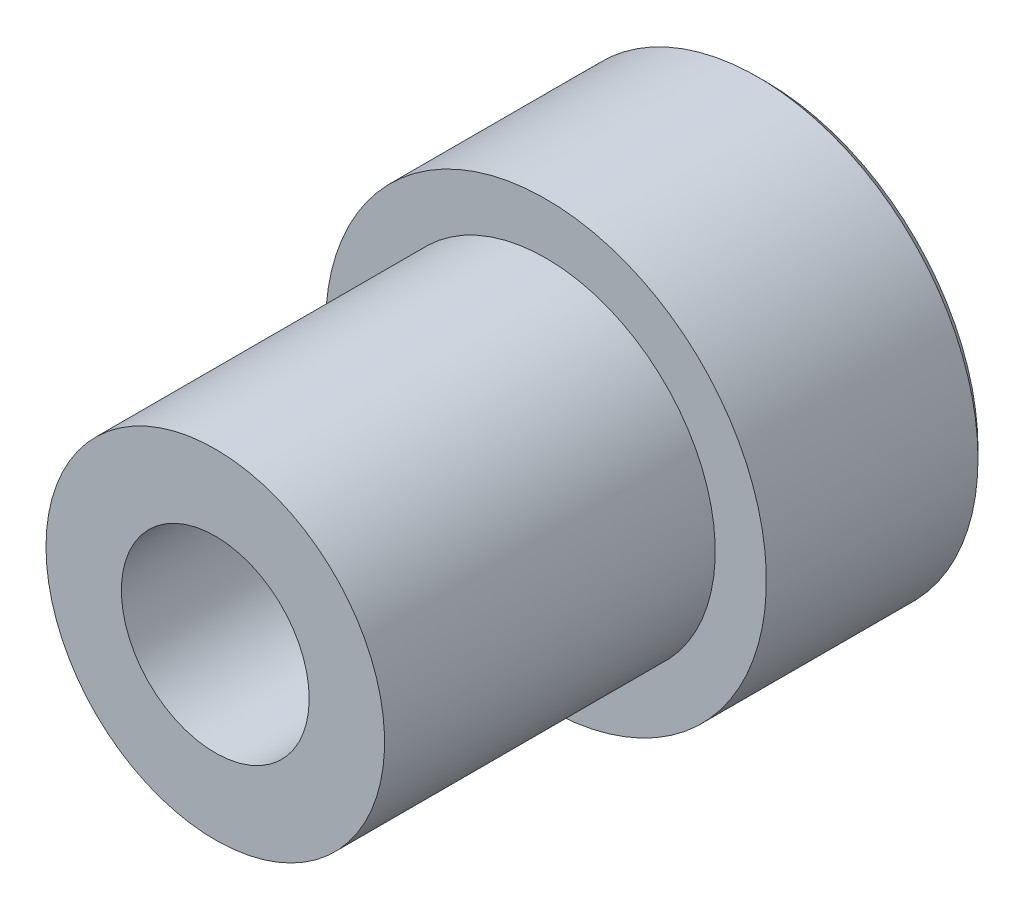
ISO-10303-21;
HEADER;
FILE_DESCRIPTION(('STEP AP214'),'2;1');
FILE_NAME('part.step','',(''),(''),'','','');
FILE_SCHEMA(('AUTOMOTIVE_DESIGN { 1 0 10303 214 1 1 1 1 }'));
ENDSEC;
DATA;
#1=APPLICATION_CONTEXT('core data for automotive mechanical design processes');
#2=APPLICATION_PROTOCOL_DEFINITION('international standard','automotive_design',2000,#1);
#3=PRODUCT_CONTEXT('',#1,'mechanical');
#4=PRODUCT('Part','Part','',(#3));
#5=PRODUCT_RELATED_PRODUCT_CATEGORY('part','',(#4));
#6=PRODUCT_DEFINITION_FORMATION('','',#4);
#7=PRODUCT_DEFINITION_CONTEXT('part definition',#1,'design');
#8=PRODUCT_DEFINITION('design','',#6,#7);
#9=PRODUCT_DEFINITION_SHAPE('','',#8);
#10=(LENGTH_UNIT() NAMED_UNIT(*) SI_UNIT(.MILLI.,.METRE.));
#11=(NAMED_UNIT(*) PLANE_ANGLE_UNIT() SI_UNIT($,.RADIAN.));
#12=(NAMED_UNIT(*) SI_UNIT($,.STERADIAN.) SOLID_ANGLE_UNIT());
#13=UNCERTAINTY_MEASURE_WITH_UNIT(LENGTH_MEASURE(1.E-05),#10,'distance_accuracy_value','');
#14=(GEOMETRIC_REPRESENTATION_CONTEXT(3) GLOBAL_UNCERTAINTY_ASSIGNED_CONTEXT((#13)) GLOBAL_UNIT_ASSIGNED_CONTEXT((#10,
#11,#12)) REPRESENTATION_CONTEXT('',''));
#15=CARTESIAN_POINT('',(0.,0.,0.));
#16=DIRECTION('',(0.,0.,1.));
#17=DIRECTION('',(1.,0.,0.));
#18=AXIS2_PLACEMENT_3D('',#15,#16,#17);
#19=CARTESIAN_POINT('',(0.,0.,-15.875));
#20=DIRECTION('',(0.,0.,1.));
#21=DIRECTION('',(-1.,0.,0.));
#22=AXIS2_PLACEMENT_3D('',#19,#20,#21);
#23=CYLINDRICAL_SURFACE('',#22,6.35);
#24=CARTESIAN_POINT('',(0.,0.,-15.621));
#25=DIRECTION('',(0.,0.,1.));
#26=DIRECTION('',(1.,0.,0.));
#27=AXIS2_PLACEMENT_3D('',#24,#25,#26);
#28=CIRCLE('',#27,6.35);
#29=CARTESIAN_POINT('',(6.35,0.,-15.621));
#30=VERTEX_POINT('',#29);
#31=EDGE_CURVE('E10',#30,#30,#28,.F.);
#32=ORIENTED_EDGE('',*,*,#31,.F.);
#33=EDGE_LOOP('',(#32));
#34=FACE_BOUND('',#33,.T.);
#35=CARTESIAN_POINT('',(0.,0.,-9.525));
#36=DIRECTION('',(0.,0.,-1.));
#37=DIRECTION('',(-1.,0.,0.));
#38=AXIS2_PLACEMENT_3D('',#35,#36,#37);
#39=CIRCLE('',#38,6.35);
#40=CARTESIAN_POINT('',(-6.35,0.,-9.525));
#41=VERTEX_POINT('',#40);
#42=EDGE_CURVE('E49',#41,#41,#39,.T.);
#43=ORIENTED_EDGE('',*,*,#42,.T.);
#44=EDGE_LOOP('',(#43));
#45=FACE_BOUND('',#44,.T.);
#46=ADVANCED_FACE('F45',(#34,#45),#23,.T.);
#47=CARTESIAN_POINT('',(0.,0.,-15.875));
#48=DIRECTION('',(0.,0.,-1.));
#49=DIRECTION('',(1.,0.,0.));
#50=AXIS2_PLACEMENT_3D('',#47,#48,#49);
#51=PLANE('',#50);
#52=CARTESIAN_POINT('',(0.,0.,-15.875));
#53=DIRECTION('',(0.,0.,1.));
#54=DIRECTION('',(1.,0.,0.));
#55=AXIS2_PLACEMENT_3D('',#52,#53,#54);
#56=CIRCLE('',#55,2.7051);
#57=CARTESIAN_POINT('',(2.7051,0.,-15.875));
#58=VERTEX_POINT('',#57);
#59=EDGE_CURVE('E74',#58,#58,#56,.T.);
#60=ORIENTED_EDGE('',*,*,#59,.T.);
#61=EDGE_LOOP('',(#60));
#62=FACE_BOUND('',#61,.T.);
#63=CARTESIAN_POINT('',(0.,0.,-15.875));
#64=DIRECTION('',(0.,0.,1.));
#65=DIRECTION('',(1.,0.,0.));
#66=AXIS2_PLACEMENT_3D('',#63,#64,#65);
#67=CIRCLE('',#66,6.096);
#68=CARTESIAN_POINT('',(6.096,0.,-15.875));
#69=VERTEX_POINT('',#68);
#70=EDGE_CURVE('E54',#69,#69,#67,.T.);
#71=ORIENTED_EDGE('',*,*,#70,.F.);
#72=EDGE_LOOP('',(#71));
#73=FACE_BOUND('',#72,.T.);
#74=ADVANCED_FACE('F81',(#62,#73),#51,.T.);
#75=CARTESIAN_POINT('',(0.,0.,-15.875));
#76=DIRECTION('',(0.,0.,1.));
#77=DIRECTION('',(-1.,0.,0.));
#78=AXIS2_PLACEMENT_3D('',#75,#76,#77);
#79=CONICAL_SURFACE('',#78,6.096,0.785398163397445);
#80=ORIENTED_EDGE('',*,*,#31,.T.);
#81=EDGE_LOOP('',(#80));
#82=FACE_BOUND('',#81,.T.);
#83=ORIENTED_EDGE('',*,*,#70,.T.);
#84=EDGE_LOOP('',(#83));
#85=FACE_BOUND('',#84,.T.);
#86=ADVANCED_FACE('F47',(#82,#85),#79,.T.);
#87=CARTESIAN_POINT('',(0.,0.,-9.525));
#88=DIRECTION('',(0.,0.,1.));
#89=DIRECTION('',(-1.,0.,0.));
#90=AXIS2_PLACEMENT_3D('',#87,#88,#89);
#91=PLANE('',#90);
#92=CARTESIAN_POINT('',(0.,0.,-9.525));
#93=DIRECTION('',(0.,0.,-1.));
#94=DIRECTION('',(-1.,0.,0.));
#95=AXIS2_PLACEMENT_3D('',#92,#93,#94);
#96=CIRCLE('',#95,4.8768);
#97=CARTESIAN_POINT('',(-4.8768,0.,-9.525));
#98=VERTEX_POINT('',#97);
#99=EDGE_CURVE('E66',#98,#98,#96,.T.);
#100=ORIENTED_EDGE('',*,*,#99,.T.);
#101=EDGE_LOOP('',(#100));
#102=FACE_BOUND('',#101,.T.);
#103=ORIENTED_EDGE('',*,*,#42,.F.);
#104=EDGE_LOOP('',(#103));
#105=FACE_BOUND('',#104,.T.);
#106=ADVANCED_FACE('F104',(#102,#105),#91,.T.);
#107=CARTESIAN_POINT('',(0.,0.,-9.525));
#108=DIRECTION('',(0.,0.,1.));
#109=DIRECTION('',(-1.,0.,0.));
#110=AXIS2_PLACEMENT_3D('',#107,#108,#109);
#111=CYLINDRICAL_SURFACE('',#110,4.8768);
#112=CARTESIAN_POINT('',(0.,0.,0.));
#113=DIRECTION('',(0.,0.,-1.));
#114=DIRECTION('',(-1.,0.,0.));
#115=AXIS2_PLACEMENT_3D('',#112,#113,#114);
#116=CIRCLE('',#115,4.8768);
#117=CARTESIAN_POINT('',(-4.8768,0.,0.));
#118=VERTEX_POINT('',#117);
#119=EDGE_CURVE('E62',#118,#118,#116,.T.);
#120=CARTESIAN_POINT('',(-4.8768,0.,-9.525));
#121=CARTESIAN_POINT('',(-4.8768,0.,-9.42578125));
#122=CARTESIAN_POINT('',(-4.8768,0.,-9.3265625));
#123=CARTESIAN_POINT('',(-4.8768,0.,-9.128125));
#124=CARTESIAN_POINT('',(-4.8768,0.,-9.02890625));
#125=CARTESIAN_POINT('',(-4.8768,0.,-8.83046875));
#126=CARTESIAN_POINT('',(-4.8768,0.,-8.73125));
#127=CARTESIAN_POINT('',(-4.8768,0.,-8.5328125));
#128=CARTESIAN_POINT('',(-4.8768,0.,-8.43359375));
#129=CARTESIAN_POINT('',(-4.8768,0.,-8.23515625));
#130=CARTESIAN_POINT('',(-4.8768,0.,-8.1359375));
#131=CARTESIAN_POINT('',(-4.8768,0.,-7.9375));
#132=CARTESIAN_POINT('',(-4.8768,0.,-7.83828125));
#133=CARTESIAN_POINT('',(-4.8768,0.,-7.63984375));
#134=CARTESIAN_POINT('',(-4.8768,0.,-7.540625));
#135=CARTESIAN_POINT('',(-4.8768,0.,-7.3421875));
#136=CARTESIAN_POINT('',(-4.8768,0.,-7.24296875));
#137=CARTESIAN_POINT('',(-4.8768,0.,-7.04453125));
#138=CARTESIAN_POINT('',(-4.8768,0.,-6.9453125));
#139=CARTESIAN_POINT('',(-4.8768,0.,-6.746875));
#140=CARTESIAN_POINT('',(-4.8768,0.,-6.64765625));
#141=CARTESIAN_POINT('',(-4.8768,0.,-6.44921875));
#142=CARTESIAN_POINT('',(-4.8768,0.,-6.35));
#143=CARTESIAN_POINT('',(-4.8768,0.,-6.1515625));
#144=CARTESIAN_POINT('',(-4.8768,0.,-6.05234375));
#145=CARTESIAN_POINT('',(-4.8768,0.,-5.85390625));
#146=CARTESIAN_POINT('',(-4.8768,0.,-5.7546875));
#147=CARTESIAN_POINT('',(-4.8768,0.,-5.55625));
#148=CARTESIAN_POINT('',(-4.8768,0.,-5.45703125));
#149=CARTESIAN_POINT('',(-4.8768,0.,-5.25859375));
#150=CARTESIAN_POINT('',(-4.8768,0.,-5.159375));
#151=CARTESIAN_POINT('',(-4.8768,0.,-4.9609375));
#152=CARTESIAN_POINT('',(-4.8768,0.,-4.86171875));
#153=CARTESIAN_POINT('',(-4.8768,0.,-4.66328125));
#154=CARTESIAN_POINT('',(-4.8768,0.,-4.5640625));
#155=CARTESIAN_POINT('',(-4.8768,0.,-4.365625));
#156=CARTESIAN_POINT('',(-4.8768,0.,-4.26640625));
#157=CARTESIAN_POINT('',(-4.8768,0.,-4.06796875));
#158=CARTESIAN_POINT('',(-4.8768,0.,-3.96875));
#159=CARTESIAN_POINT('',(-4.8768,0.,-3.7703125));
#160=CARTESIAN_POINT('',(-4.8768,0.,-3.67109375));
#161=CARTESIAN_POINT('',(-4.8768,0.,-3.47265625));
#162=CARTESIAN_POINT('',(-4.8768,0.,-3.3734375));
#163=CARTESIAN_POINT('',(-4.8768,0.,-3.175));
#164=CARTESIAN_POINT('',(-4.8768,0.,-3.07578125));
#165=CARTESIAN_POINT('',(-4.8768,0.,-2.87734375));
#166=CARTESIAN_POINT('',(-4.8768,0.,-2.778125));
#167=CARTESIAN_POINT('',(-4.8768,0.,-2.5796875));
#168=CARTESIAN_POINT('',(-4.8768,0.,-2.48046875));
#169=CARTESIAN_POINT('',(-4.8768,0.,-2.28203125));
#170=CARTESIAN_POINT('',(-4.8768,0.,-2.1828125));
#171=CARTESIAN_POINT('',(-4.8768,0.,-1.984375));
#172=CARTESIAN_POINT('',(-4.8768,0.,-1.88515625));
#173=CARTESIAN_POINT('',(-4.8768,0.,-1.68671875));
#174=CARTESIAN_POINT('',(-4.8768,0.,-1.5875));
#175=CARTESIAN_POINT('',(-4.8768,0.,-1.3890625));
#176=CARTESIAN_POINT('',(-4.8768,0.,-1.28984375));
#177=CARTESIAN_POINT('',(-4.8768,0.,-1.09140625));
#178=CARTESIAN_POINT('',(-4.8768,0.,-0.992187500000001));
#179=CARTESIAN_POINT('',(-4.8768,0.,-0.793750000000001));
#180=CARTESIAN_POINT('',(-4.8768,0.,-0.69453125));
#181=CARTESIAN_POINT('',(-4.8768,0.,-0.49609375));
#182=CARTESIAN_POINT('',(-4.8768,0.,-0.396875));
#183=CARTESIAN_POINT('',(-4.8768,0.,-0.1984375));
#184=CARTESIAN_POINT('',(-4.8768,0.,-0.0992187500000001));
#185=CARTESIAN_POINT('',(-4.8768,0.,0.));
#186=B_SPLINE_CURVE_WITH_KNOTS('',3,(#120,#121,#122,#123,#124,#125,#126,#127,#128,#129,#130,
#131,#132,#133,#134,#135,#136,#137,#138,#139,#140,#141,#142,#143,#144,#145,#146,#147,#148,#149,
#150,#151,#152,#153,#154,#155,#156,#157,#158,#159,#160,#161,#162,#163,#164,#165,#166,#167,#168,
#169,#170,#171,#172,#173,#174,#175,#176,#177,#178,#179,#180,#181,#182,#183,#184,#185),
.UNSPECIFIED.,.F.,.F.,(4,2,2,2,2,2,2,2,2,2,2,2,2,2,2,2,2,2,2,2,2,2,2,2,2,2,2,2,2,2,2,2,4),(0.,
0.29765625,0.5953125,0.892968750000001,1.190625,1.48828125,1.7859375,2.08359375,2.38125,
2.67890625,2.9765625,3.27421875,3.571875,3.86953125,4.1671875,4.46484375,4.7625,5.06015625,
5.3578125,5.65546875,5.953125,6.25078125,6.5484375,6.84609375,7.14375,7.44140625,7.7390625,
8.03671875,8.334375,8.63203125,8.9296875,9.22734375,9.525),.UNSPECIFIED.);
#187=EDGE_CURVE('BSEAM92',#98,#118,#186,.T.);
#188=ORIENTED_EDGE('',*,*,#99,.F.);
#189=ORIENTED_EDGE('',*,*,#119,.T.);
#190=ORIENTED_EDGE('',*,*,#187,.T.);
#191=ORIENTED_EDGE('',*,*,#187,.F.);
#192=EDGE_LOOP('',(#188,#190,#189,#191));
#193=FACE_BOUND('',#192,.T.);
#194=ADVANCED_FACE('F92',(#193),#111,.T.);
#195=CARTESIAN_POINT('',(0.,0.,0.));
#196=DIRECTION('',(0.,0.,-1.));
#197=DIRECTION('',(1.,0.,0.));
#198=AXIS2_PLACEMENT_3D('',#195,#196,#197);
#199=PLANE('',#198);
#200=CARTESIAN_POINT('',(0.,0.,0.));
#201=DIRECTION('',(0.,0.,1.));
#202=DIRECTION('',(1.,0.,0.));
#203=AXIS2_PLACEMENT_3D('',#200,#201,#202);
#204=CIRCLE('',#203,2.7051);
#205=CARTESIAN_POINT('',(2.7051,0.,0.));
#206=VERTEX_POINT('',#205);
#207=EDGE_CURVE('E67',#206,#206,#204,.T.);
#208=ORIENTED_EDGE('',*,*,#207,.F.);
#209=EDGE_LOOP('',(#208));
#210=FACE_BOUND('',#209,.T.);
#211=ORIENTED_EDGE('',*,*,#119,.F.);
#212=EDGE_LOOP('',(#211));
#213=FACE_BOUND('',#212,.T.);
#214=ADVANCED_FACE('F86',(#210,#213),#199,.F.);
#215=CARTESIAN_POINT('',(0.,0.,-15.875));
#216=DIRECTION('',(0.,0.,-1.));
#217=DIRECTION('',(1.,0.,0.));
#218=AXIS2_PLACEMENT_3D('',#215,#216,#217);
#219=CYLINDRICAL_SURFACE('',#218,2.7051);
#220=ORIENTED_EDGE('',*,*,#207,.T.);
#221=EDGE_LOOP('',(#220));
#222=FACE_BOUND('',#221,.T.);
#223=ORIENTED_EDGE('',*,*,#59,.F.);
#224=EDGE_LOOP('',(#223));
#225=FACE_BOUND('',#224,.T.);
#226=ADVANCED_FACE('F84',(#222,#225),#219,.F.);
#227=CLOSED_SHELL('',(#46,#74,#86,#106,#194,#214,#226));
#228=MANIFOLD_SOLID_BREP('B2',#227);
#229=ADVANCED_BREP_SHAPE_REPRESENTATION('',(#18,#228),#14);
#230=SHAPE_DEFINITION_REPRESENTATION(#9,#229);
ENDSEC;
END-ISO-10303-21;
